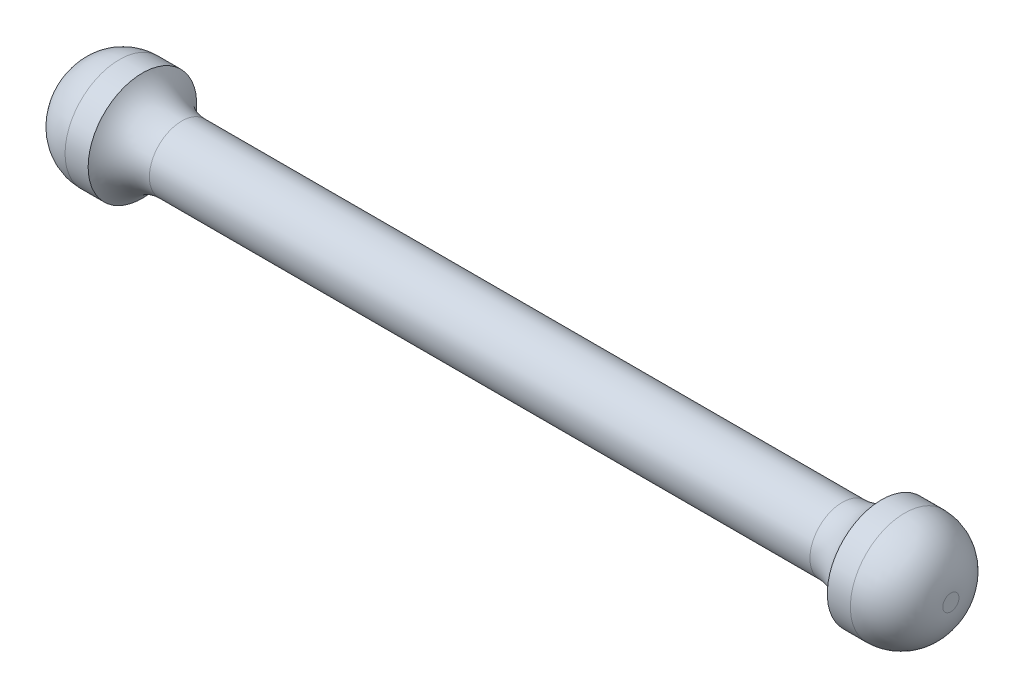
ISO-10303-21;
HEADER;
FILE_DESCRIPTION(('STEP AP214'),'2;1');
FILE_NAME('part.step','',(''),(''),'','','');
FILE_SCHEMA(('AUTOMOTIVE_DESIGN { 1 0 10303 214 1 1 1 1 }'));
ENDSEC;
DATA;
#1=APPLICATION_CONTEXT('core data for automotive mechanical design processes');
#2=APPLICATION_PROTOCOL_DEFINITION('international standard','automotive_design',2000,#1);
#3=PRODUCT_CONTEXT('',#1,'mechanical');
#4=PRODUCT('Part','Part','',(#3));
#5=PRODUCT_RELATED_PRODUCT_CATEGORY('part','',(#4));
#6=PRODUCT_DEFINITION_FORMATION('','',#4);
#7=PRODUCT_DEFINITION_CONTEXT('part definition',#1,'design');
#8=PRODUCT_DEFINITION('design','',#6,#7);
#9=PRODUCT_DEFINITION_SHAPE('','',#8);
#10=(LENGTH_UNIT() NAMED_UNIT(*) SI_UNIT(.MILLI.,.METRE.));
#11=(NAMED_UNIT(*) PLANE_ANGLE_UNIT() SI_UNIT($,.RADIAN.));
#12=(NAMED_UNIT(*) SI_UNIT($,.STERADIAN.) SOLID_ANGLE_UNIT());
#13=UNCERTAINTY_MEASURE_WITH_UNIT(LENGTH_MEASURE(1.E-05),#10,'distance_accuracy_value','');
#14=(GEOMETRIC_REPRESENTATION_CONTEXT(3) GLOBAL_UNCERTAINTY_ASSIGNED_CONTEXT((#13)) GLOBAL_UNIT_ASSIGNED_CONTEXT((#10,
#11,#12)) REPRESENTATION_CONTEXT('',''));
#15=CARTESIAN_POINT('',(0.,0.,0.));
#16=DIRECTION('',(0.,0.,1.));
#17=DIRECTION('',(1.,0.,0.));
#18=AXIS2_PLACEMENT_3D('',#15,#16,#17);
#19=CARTESIAN_POINT('',(-16.,33.0000000000002,-32.2332416321054));
#20=DIRECTION('',(1.,0.,0.));
#21=DIRECTION('',(0.,0.,-1.));
#22=AXIS2_PLACEMENT_3D('',#19,#20,#21);
#23=CYLINDRICAL_SURFACE('',#22,1.4);
#24=CARTESIAN_POINT('',(-14.2977955469451,33.0000000000002,-32.2332416321054));
#25=DIRECTION('',(-1.,0.,0.));
#26=DIRECTION('',(0.,0.,1.));
#27=AXIS2_PLACEMENT_3D('',#24,#25,#26);
#28=CIRCLE('',#27,1.4);
#29=CARTESIAN_POINT('',(-14.2977955469451,33.0000000000002,-30.8332416321054));
#30=VERTEX_POINT('',#29);
#31=EDGE_CURVE('E50',#30,#30,#28,.F.);
#32=ORIENTED_EDGE('',*,*,#31,.T.);
#33=EDGE_LOOP('',(#32));
#34=FACE_BOUND('',#33,.T.);
#35=CARTESIAN_POINT('',(14.2977955469451,33.0000000000002,-32.2332416321054));
#36=DIRECTION('',(1.,0.,0.));
#37=DIRECTION('',(0.,0.,-1.));
#38=AXIS2_PLACEMENT_3D('',#35,#36,#37);
#39=CIRCLE('',#38,1.4);
#40=CARTESIAN_POINT('',(14.2977955469451,33.0000000000002,-33.6332416321054));
#41=VERTEX_POINT('',#40);
#42=EDGE_CURVE('E62',#41,#41,#39,.F.);
#43=ORIENTED_EDGE('',*,*,#42,.T.);
#44=EDGE_LOOP('',(#43));
#45=FACE_BOUND('',#44,.T.);
#46=ADVANCED_FACE('F39',(#34,#45),#23,.T.);
#47=CARTESIAN_POINT('',(19.,33.0000000000002,-32.2332416321054));
#48=DIRECTION('',(-1.,0.,0.));
#49=DIRECTION('',(0.,0.,1.));
#50=AXIS2_PLACEMENT_3D('',#47,#48,#49);
#51=CYLINDRICAL_SURFACE('',#50,2.35);
#52=CARTESIAN_POINT('',(17.,33.0000000000002,-32.2332416321054));
#53=DIRECTION('',(1.,0.,0.));
#54=DIRECTION('',(0.,0.,-1.));
#55=AXIS2_PLACEMENT_3D('',#52,#53,#54);
#56=CIRCLE('',#55,2.35);
#57=CARTESIAN_POINT('',(17.,33.0000000000002,-34.5832416321054));
#58=VERTEX_POINT('',#57);
#59=EDGE_CURVE('E54',#58,#58,#56,.F.);
#60=ORIENTED_EDGE('',*,*,#59,.T.);
#61=EDGE_LOOP('',(#60));
#62=FACE_BOUND('',#61,.T.);
#63=CARTESIAN_POINT('',(16.,33.0000000000002,-32.2332416321054));
#64=DIRECTION('',(1.,0.,0.));
#65=DIRECTION('',(0.,0.,-1.));
#66=AXIS2_PLACEMENT_3D('',#63,#64,#65);
#67=CIRCLE('',#66,2.35);
#68=CARTESIAN_POINT('',(16.,33.0000000000002,-34.5832416321054));
#69=VERTEX_POINT('',#68);
#70=EDGE_CURVE('E65',#69,#69,#67,.T.);
#71=ORIENTED_EDGE('',*,*,#70,.T.);
#72=EDGE_LOOP('',(#71));
#73=FACE_BOUND('',#72,.T.);
#74=ADVANCED_FACE('F82',(#62,#73),#51,.T.);
#75=CARTESIAN_POINT('',(19.,33.0000000000002,-32.2332416321054));
#76=DIRECTION('',(1.,0.,0.));
#77=DIRECTION('',(0.,0.,-1.));
#78=AXIS2_PLACEMENT_3D('',#75,#76,#77);
#79=PLANE('',#78);
#80=CARTESIAN_POINT('',(19.,33.0000000000002,-32.2332416321054));
#81=DIRECTION('',(1.,0.,0.));
#82=DIRECTION('',(0.,0.,-1.));
#83=AXIS2_PLACEMENT_3D('',#80,#81,#82);
#84=CIRCLE('',#83,0.349999999999996);
#85=CARTESIAN_POINT('',(19.,33.0000000000002,-32.5832416321054));
#86=VERTEX_POINT('',#85);
#87=EDGE_CURVE('E59',#86,#86,#84,.T.);
#88=ORIENTED_EDGE('',*,*,#87,.T.);
#89=EDGE_LOOP('',(#88));
#90=FACE_BOUND('',#89,.T.);
#91=ADVANCED_FACE('F90',(#90),#79,.T.);
#92=CARTESIAN_POINT('',(14.2977955469451,33.0000000000002,-32.2332416321054));
#93=DIRECTION('',(1.,0.,0.));
#94=DIRECTION('',(0.,0.,-1.));
#95=AXIS2_PLACEMENT_3D('',#92,#93,#94);
#96=TOROIDAL_SURFACE('',#95,3.4,2.);
#97=ORIENTED_EDGE('',*,*,#42,.F.);
#98=EDGE_LOOP('',(#97));
#99=FACE_BOUND('',#98,.T.);
#100=ORIENTED_EDGE('',*,*,#70,.F.);
#101=EDGE_LOOP('',(#100));
#102=FACE_BOUND('',#101,.T.);
#103=ADVANCED_FACE('F86',(#99,#102),#96,.F.);
#104=CARTESIAN_POINT('',(17.,33.0000000000002,-32.2332416321054));
#105=DIRECTION('',(1.,0.,0.));
#106=DIRECTION('',(0.,0.,-1.));
#107=AXIS2_PLACEMENT_3D('',#104,#105,#106);
#108=DEGENERATE_TOROIDAL_SURFACE('',#107,0.349999999999996,2.,.T.);
#109=ORIENTED_EDGE('',*,*,#59,.F.);
#110=EDGE_LOOP('',(#109));
#111=FACE_BOUND('',#110,.T.);
#112=ORIENTED_EDGE('',*,*,#87,.F.);
#113=EDGE_LOOP('',(#112));
#114=FACE_BOUND('',#113,.T.);
#115=ADVANCED_FACE('F89',(#111,#114),#108,.T.);
#116=CARTESIAN_POINT('',(-19.,33.0000000000002,-32.2332416321054));
#117=DIRECTION('',(1.,0.,0.));
#118=DIRECTION('',(0.,0.,-1.));
#119=AXIS2_PLACEMENT_3D('',#116,#117,#118);
#120=CYLINDRICAL_SURFACE('',#119,2.35);
#121=CARTESIAN_POINT('',(-17.,33.0000000000002,-32.2332416321054));
#122=DIRECTION('',(-1.,0.,0.));
#123=DIRECTION('',(0.,0.,1.));
#124=AXIS2_PLACEMENT_3D('',#121,#122,#123);
#125=CIRCLE('',#124,2.35);
#126=CARTESIAN_POINT('',(-17.,33.0000000000002,-29.8832416321054));
#127=VERTEX_POINT('',#126);
#128=EDGE_CURVE('E10',#127,#127,#125,.F.);
#129=ORIENTED_EDGE('',*,*,#128,.T.);
#130=EDGE_LOOP('',(#129));
#131=FACE_BOUND('',#130,.T.);
#132=CARTESIAN_POINT('',(-16.,33.0000000000002,-32.2332416321054));
#133=DIRECTION('',(-1.,0.,0.));
#134=DIRECTION('',(0.,0.,1.));
#135=AXIS2_PLACEMENT_3D('',#132,#133,#134);
#136=CIRCLE('',#135,2.35);
#137=CARTESIAN_POINT('',(-16.,33.0000000000002,-29.8832416321054));
#138=VERTEX_POINT('',#137);
#139=EDGE_CURVE('E68',#138,#138,#136,.T.);
#140=ORIENTED_EDGE('',*,*,#139,.T.);
#141=EDGE_LOOP('',(#140));
#142=FACE_BOUND('',#141,.T.);
#143=ADVANCED_FACE('F72',(#131,#142),#120,.T.);
#144=CARTESIAN_POINT('',(-19.,33.0000000000002,-32.2332416321054));
#145=DIRECTION('',(-1.,0.,0.));
#146=DIRECTION('',(0.,0.,1.));
#147=AXIS2_PLACEMENT_3D('',#144,#145,#146);
#148=PLANE('',#147);
#149=CARTESIAN_POINT('',(-19.,33.0000000000002,-32.2332416321054));
#150=DIRECTION('',(-1.,0.,0.));
#151=DIRECTION('',(0.,0.,1.));
#152=AXIS2_PLACEMENT_3D('',#149,#150,#151);
#153=CIRCLE('',#152,0.350000000000003);
#154=CARTESIAN_POINT('',(-19.,33.0000000000002,-31.8832416321054));
#155=VERTEX_POINT('',#154);
#156=EDGE_CURVE('E46',#155,#155,#153,.T.);
#157=ORIENTED_EDGE('',*,*,#156,.T.);
#158=EDGE_LOOP('',(#157));
#159=FACE_BOUND('',#158,.T.);
#160=ADVANCED_FACE('F77',(#159),#148,.T.);
#161=CARTESIAN_POINT('',(-14.2977955469451,33.0000000000002,-32.2332416321054));
#162=DIRECTION('',(-1.,0.,0.));
#163=DIRECTION('',(0.,0.,1.));
#164=AXIS2_PLACEMENT_3D('',#161,#162,#163);
#165=TOROIDAL_SURFACE('',#164,3.4,2.);
#166=ORIENTED_EDGE('',*,*,#139,.F.);
#167=EDGE_LOOP('',(#166));
#168=FACE_BOUND('',#167,.T.);
#169=ORIENTED_EDGE('',*,*,#31,.F.);
#170=EDGE_LOOP('',(#169));
#171=FACE_BOUND('',#170,.T.);
#172=ADVANCED_FACE('F74',(#168,#171),#165,.F.);
#173=CARTESIAN_POINT('',(-17.,33.0000000000002,-32.2332416321054));
#174=DIRECTION('',(-1.,0.,0.));
#175=DIRECTION('',(0.,0.,1.));
#176=AXIS2_PLACEMENT_3D('',#173,#174,#175);
#177=DEGENERATE_TOROIDAL_SURFACE('',#176,0.350000000000003,2.,.T.);
#178=ORIENTED_EDGE('',*,*,#128,.F.);
#179=EDGE_LOOP('',(#178));
#180=FACE_BOUND('',#179,.T.);
#181=ORIENTED_EDGE('',*,*,#156,.F.);
#182=EDGE_LOOP('',(#181));
#183=FACE_BOUND('',#182,.T.);
#184=ADVANCED_FACE('F41',(#180,#183),#177,.T.);
#185=CLOSED_SHELL('',(#46,#74,#91,#103,#115,#143,#160,#172,#184));
#186=MANIFOLD_SOLID_BREP('B2',#185);
#187=ADVANCED_BREP_SHAPE_REPRESENTATION('',(#18,#186),#14);
#188=SHAPE_DEFINITION_REPRESENTATION(#9,#187);
ENDSEC;
END-ISO-10303-21;
